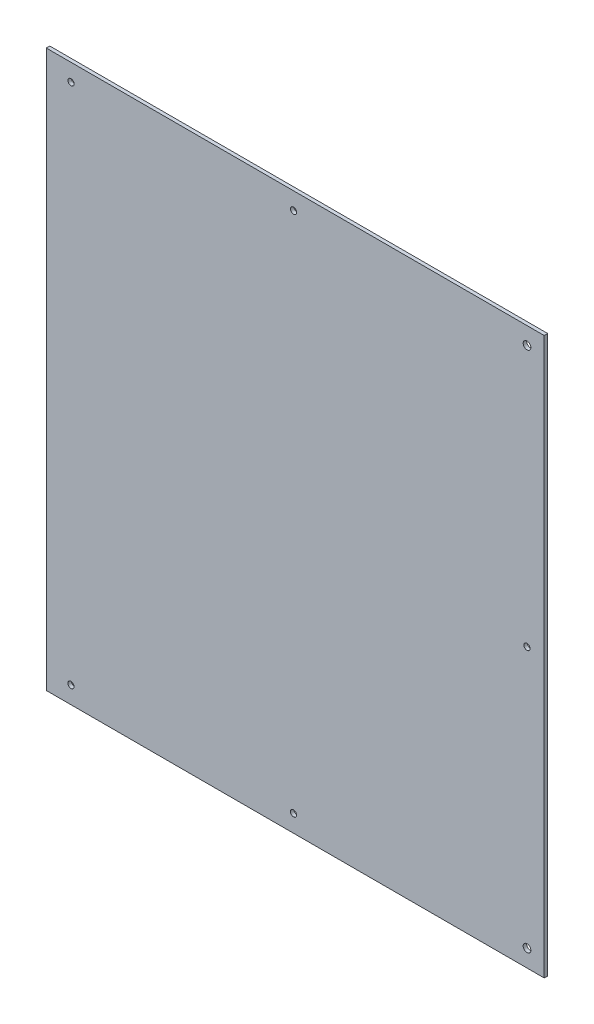
ISO-10303-21;
HEADER;
FILE_DESCRIPTION(('STEP AP214'),'2;1');
FILE_NAME('part.step','',(''),(''),'','','');
FILE_SCHEMA(('AUTOMOTIVE_DESIGN { 1 0 10303 214 1 1 1 1 }'));
ENDSEC;
DATA;
#1=APPLICATION_CONTEXT('core data for automotive mechanical design processes');
#2=APPLICATION_PROTOCOL_DEFINITION('international standard','automotive_design',2000,#1);
#3=PRODUCT_CONTEXT('',#1,'mechanical');
#4=PRODUCT('Part','Part','',(#3));
#5=PRODUCT_RELATED_PRODUCT_CATEGORY('part','',(#4));
#6=PRODUCT_DEFINITION_FORMATION('','',#4);
#7=PRODUCT_DEFINITION_CONTEXT('part definition',#1,'design');
#8=PRODUCT_DEFINITION('design','',#6,#7);
#9=PRODUCT_DEFINITION_SHAPE('','',#8);
#10=(LENGTH_UNIT() NAMED_UNIT(*) SI_UNIT(.MILLI.,.METRE.));
#11=(NAMED_UNIT(*) PLANE_ANGLE_UNIT() SI_UNIT($,.RADIAN.));
#12=(NAMED_UNIT(*) SI_UNIT($,.STERADIAN.) SOLID_ANGLE_UNIT());
#13=UNCERTAINTY_MEASURE_WITH_UNIT(LENGTH_MEASURE(1.E-05),#10,'distance_accuracy_value','');
#14=(GEOMETRIC_REPRESENTATION_CONTEXT(3) GLOBAL_UNCERTAINTY_ASSIGNED_CONTEXT((#13)) GLOBAL_UNIT_ASSIGNED_CONTEXT((#10,
#11,#12)) REPRESENTATION_CONTEXT('',''));
#15=CARTESIAN_POINT('',(0.,0.,0.));
#16=DIRECTION('',(0.,0.,1.));
#17=DIRECTION('',(1.,0.,0.));
#18=AXIS2_PLACEMENT_3D('',#15,#16,#17);
#19=CARTESIAN_POINT('',(0.,0.,3.175));
#20=DIRECTION('',(0.,0.,-1.));
#21=DIRECTION('',(-1.,0.,0.));
#22=AXIS2_PLACEMENT_3D('',#19,#20,#21);
#23=PLANE('',#22);
#24=DIRECTION('',(1.,0.,0.));
#25=VECTOR('',#24,1.);
#26=CARTESIAN_POINT('',(0.,253.175,3.175));
#27=LINE('',#26,#25);
#28=CARTESIAN_POINT('',(-225.,253.175,3.175));
#29=VERTEX_POINT('',#28);
#30=CARTESIAN_POINT('',(228.175,253.175,3.175));
#31=VERTEX_POINT('',#30);
#32=EDGE_CURVE('E112',#29,#31,#27,.T.);
#33=ORIENTED_EDGE('',*,*,#32,.F.);
#34=DIRECTION('',(0.,-1.,0.));
#35=VECTOR('',#34,1.);
#36=CARTESIAN_POINT('',(-225.,-250.,3.175));
#37=LINE('',#36,#35);
#38=CARTESIAN_POINT('',(-225.,-253.175,3.175));
#39=VERTEX_POINT('',#38);
#40=EDGE_CURVE('E11',#29,#39,#37,.T.);
#41=ORIENTED_EDGE('',*,*,#40,.T.);
#42=DIRECTION('',(1.,0.,0.));
#43=VECTOR('',#42,1.);
#44=CARTESIAN_POINT('',(0.,-253.175,3.175));
#45=LINE('',#44,#43);
#46=CARTESIAN_POINT('',(228.175,-253.175,3.175));
#47=VERTEX_POINT('',#46);
#48=EDGE_CURVE('E107',#39,#47,#45,.T.);
#49=ORIENTED_EDGE('',*,*,#48,.T.);
#50=DIRECTION('',(0.,-1.,0.));
#51=VECTOR('',#50,1.);
#52=CARTESIAN_POINT('',(228.175000000002,-1.99468613105393E-12,3.175));
#53=LINE('',#52,#51);
#54=EDGE_CURVE('E110',#31,#47,#53,.T.);
#55=ORIENTED_EDGE('',*,*,#54,.F.);
#56=EDGE_LOOP('',(#33,#41,#49,#55));
#57=FACE_BOUND('',#56,.T.);
#58=CARTESIAN_POINT('',(212.5,237.5,3.175));
#59=DIRECTION('',(0.,0.,1.));
#60=DIRECTION('',(1.,0.,0.));
#61=AXIS2_PLACEMENT_3D('',#58,#59,#60);
#62=CIRCLE('',#61,3.49999999999999);
#63=CARTESIAN_POINT('',(216.,237.5,3.175));
#64=VERTEX_POINT('',#63);
#65=EDGE_CURVE('E96',#64,#64,#62,.T.);
#66=ORIENTED_EDGE('',*,*,#65,.F.);
#67=EDGE_LOOP('',(#66));
#68=FACE_BOUND('',#67,.T.);
#69=CARTESIAN_POINT('',(212.5,-237.5,3.175));
#70=DIRECTION('',(0.,0.,1.));
#71=DIRECTION('',(1.,0.,0.));
#72=AXIS2_PLACEMENT_3D('',#69,#70,#71);
#73=CIRCLE('',#72,3.49999999999999);
#74=CARTESIAN_POINT('',(216.,-237.5,3.175));
#75=VERTEX_POINT('',#74);
#76=EDGE_CURVE('E149',#75,#75,#73,.T.);
#77=ORIENTED_EDGE('',*,*,#76,.F.);
#78=EDGE_LOOP('',(#77));
#79=FACE_BOUND('',#78,.T.);
#80=CARTESIAN_POINT('',(-202.5,-237.5,3.175));
#81=DIRECTION('',(0.,0.,1.));
#82=DIRECTION('',(1.,0.,0.));
#83=AXIS2_PLACEMENT_3D('',#80,#81,#82);
#84=CIRCLE('',#83,2.8);
#85=CARTESIAN_POINT('',(-199.7,-237.5,3.175));
#86=VERTEX_POINT('',#85);
#87=EDGE_CURVE('E143',#86,#86,#84,.T.);
#88=ORIENTED_EDGE('',*,*,#87,.F.);
#89=EDGE_LOOP('',(#88));
#90=FACE_BOUND('',#89,.T.);
#91=CARTESIAN_POINT('',(-202.5,237.5,3.175));
#92=DIRECTION('',(0.,0.,1.));
#93=DIRECTION('',(1.,0.,0.));
#94=AXIS2_PLACEMENT_3D('',#91,#92,#93);
#95=CIRCLE('',#94,2.8);
#96=CARTESIAN_POINT('',(-199.7,237.5,3.175));
#97=VERTEX_POINT('',#96);
#98=EDGE_CURVE('E137',#97,#97,#95,.T.);
#99=ORIENTED_EDGE('',*,*,#98,.F.);
#100=EDGE_LOOP('',(#99));
#101=FACE_BOUND('',#100,.T.);
#102=CARTESIAN_POINT('',(0.,-237.5,3.175));
#103=DIRECTION('',(0.,0.,1.));
#104=DIRECTION('',(1.,0.,0.));
#105=AXIS2_PLACEMENT_3D('',#102,#103,#104);
#106=CIRCLE('',#105,2.80000000000001);
#107=CARTESIAN_POINT('',(2.80000000000003,-237.5,3.175));
#108=VERTEX_POINT('',#107);
#109=EDGE_CURVE('E131',#108,#108,#106,.T.);
#110=ORIENTED_EDGE('',*,*,#109,.F.);
#111=EDGE_LOOP('',(#110));
#112=FACE_BOUND('',#111,.T.);
#113=CARTESIAN_POINT('',(0.,237.5,3.175));
#114=DIRECTION('',(0.,0.,1.));
#115=DIRECTION('',(1.,0.,0.));
#116=AXIS2_PLACEMENT_3D('',#113,#114,#115);
#117=CIRCLE('',#116,2.80000000000001);
#118=CARTESIAN_POINT('',(2.80000000000003,237.5,3.175));
#119=VERTEX_POINT('',#118);
#120=EDGE_CURVE('E125',#119,#119,#117,.T.);
#121=ORIENTED_EDGE('',*,*,#120,.F.);
#122=EDGE_LOOP('',(#121));
#123=FACE_BOUND('',#122,.T.);
#124=CARTESIAN_POINT('',(212.5,0.,3.175));
#125=DIRECTION('',(0.,0.,1.));
#126=DIRECTION('',(1.,0.,0.));
#127=AXIS2_PLACEMENT_3D('',#124,#125,#126);
#128=CIRCLE('',#127,2.8);
#129=CARTESIAN_POINT('',(215.3,0.,3.175));
#130=VERTEX_POINT('',#129);
#131=EDGE_CURVE('E119',#130,#130,#128,.T.);
#132=ORIENTED_EDGE('',*,*,#131,.F.);
#133=EDGE_LOOP('',(#132));
#134=FACE_BOUND('',#133,.T.);
#135=ADVANCED_FACE('F44',(#57,#68,#79,#90,#101,#112,#123,#134),#23,.F.);
#136=CARTESIAN_POINT('',(0.,0.,0.));
#137=DIRECTION('',(0.,0.,-1.));
#138=DIRECTION('',(-1.,0.,0.));
#139=AXIS2_PLACEMENT_3D('',#136,#137,#138);
#140=PLANE('',#139);
#141=DIRECTION('',(0.,-1.,0.));
#142=VECTOR('',#141,1.);
#143=CARTESIAN_POINT('',(-225.,-250.,0.));
#144=LINE('',#143,#142);
#145=CARTESIAN_POINT('',(-225.,253.175,0.));
#146=VERTEX_POINT('',#145);
#147=CARTESIAN_POINT('',(-225.,-253.175,0.));
#148=VERTEX_POINT('',#147);
#149=EDGE_CURVE('E48',#146,#148,#144,.T.);
#150=ORIENTED_EDGE('',*,*,#149,.F.);
#151=DIRECTION('',(1.,0.,0.));
#152=VECTOR('',#151,1.);
#153=CARTESIAN_POINT('',(0.,253.175,0.));
#154=LINE('',#153,#152);
#155=CARTESIAN_POINT('',(228.175,253.175,0.));
#156=VERTEX_POINT('',#155);
#157=EDGE_CURVE('E88',#146,#156,#154,.T.);
#158=ORIENTED_EDGE('',*,*,#157,.T.);
#159=DIRECTION('',(0.,-1.,0.));
#160=VECTOR('',#159,1.);
#161=CARTESIAN_POINT('',(228.175000000002,-1.99468613105393E-12,0.));
#162=LINE('',#161,#160);
#163=CARTESIAN_POINT('',(228.175,-253.175,0.));
#164=VERTEX_POINT('',#163);
#165=EDGE_CURVE('E61',#156,#164,#162,.T.);
#166=ORIENTED_EDGE('',*,*,#165,.T.);
#167=DIRECTION('',(1.,0.,0.));
#168=VECTOR('',#167,1.);
#169=CARTESIAN_POINT('',(0.,-253.175,0.));
#170=LINE('',#169,#168);
#171=EDGE_CURVE('E93',#148,#164,#170,.T.);
#172=ORIENTED_EDGE('',*,*,#171,.F.);
#173=EDGE_LOOP('',(#150,#158,#166,#172));
#174=FACE_BOUND('',#173,.T.);
#175=CARTESIAN_POINT('',(0.,237.5,0.));
#176=DIRECTION('',(0.,0.,1.));
#177=DIRECTION('',(1.,0.,0.));
#178=AXIS2_PLACEMENT_3D('',#175,#176,#177);
#179=CIRCLE('',#178,2.80000000000001);
#180=CARTESIAN_POINT('',(2.80000000000003,237.5,0.));
#181=VERTEX_POINT('',#180);
#182=EDGE_CURVE('E122',#181,#181,#179,.T.);
#183=ORIENTED_EDGE('',*,*,#182,.T.);
#184=EDGE_LOOP('',(#183));
#185=FACE_BOUND('',#184,.T.);
#186=CARTESIAN_POINT('',(-202.5,237.5,0.));
#187=DIRECTION('',(0.,0.,1.));
#188=DIRECTION('',(1.,0.,0.));
#189=AXIS2_PLACEMENT_3D('',#186,#187,#188);
#190=CIRCLE('',#189,2.8);
#191=CARTESIAN_POINT('',(-199.7,237.5,0.));
#192=VERTEX_POINT('',#191);
#193=EDGE_CURVE('E134',#192,#192,#190,.T.);
#194=ORIENTED_EDGE('',*,*,#193,.T.);
#195=EDGE_LOOP('',(#194));
#196=FACE_BOUND('',#195,.T.);
#197=CARTESIAN_POINT('',(212.5,-237.5,0.));
#198=DIRECTION('',(0.,0.,1.));
#199=DIRECTION('',(1.,0.,0.));
#200=AXIS2_PLACEMENT_3D('',#197,#198,#199);
#201=CIRCLE('',#200,3.49999999999999);
#202=CARTESIAN_POINT('',(216.,-237.5,0.));
#203=VERTEX_POINT('',#202);
#204=EDGE_CURVE('E146',#203,#203,#201,.T.);
#205=ORIENTED_EDGE('',*,*,#204,.T.);
#206=EDGE_LOOP('',(#205));
#207=FACE_BOUND('',#206,.T.);
#208=CARTESIAN_POINT('',(212.5,237.5,0.));
#209=DIRECTION('',(0.,0.,1.));
#210=DIRECTION('',(1.,0.,0.));
#211=AXIS2_PLACEMENT_3D('',#208,#209,#210);
#212=CIRCLE('',#211,3.49999999999999);
#213=CARTESIAN_POINT('',(216.,237.5,0.));
#214=VERTEX_POINT('',#213);
#215=EDGE_CURVE('E152',#214,#214,#212,.T.);
#216=ORIENTED_EDGE('',*,*,#215,.T.);
#217=EDGE_LOOP('',(#216));
#218=FACE_BOUND('',#217,.T.);
#219=CARTESIAN_POINT('',(-202.5,-237.5,0.));
#220=DIRECTION('',(0.,0.,1.));
#221=DIRECTION('',(1.,0.,0.));
#222=AXIS2_PLACEMENT_3D('',#219,#220,#221);
#223=CIRCLE('',#222,2.8);
#224=CARTESIAN_POINT('',(-199.7,-237.5,0.));
#225=VERTEX_POINT('',#224);
#226=EDGE_CURVE('E140',#225,#225,#223,.T.);
#227=ORIENTED_EDGE('',*,*,#226,.T.);
#228=EDGE_LOOP('',(#227));
#229=FACE_BOUND('',#228,.T.);
#230=CARTESIAN_POINT('',(0.,-237.5,0.));
#231=DIRECTION('',(0.,0.,1.));
#232=DIRECTION('',(1.,0.,0.));
#233=AXIS2_PLACEMENT_3D('',#230,#231,#232);
#234=CIRCLE('',#233,2.80000000000001);
#235=CARTESIAN_POINT('',(2.80000000000003,-237.5,0.));
#236=VERTEX_POINT('',#235);
#237=EDGE_CURVE('E128',#236,#236,#234,.T.);
#238=ORIENTED_EDGE('',*,*,#237,.T.);
#239=EDGE_LOOP('',(#238));
#240=FACE_BOUND('',#239,.T.);
#241=CARTESIAN_POINT('',(212.5,0.,0.));
#242=DIRECTION('',(0.,0.,1.));
#243=DIRECTION('',(1.,0.,0.));
#244=AXIS2_PLACEMENT_3D('',#241,#242,#243);
#245=CIRCLE('',#244,2.8);
#246=CARTESIAN_POINT('',(215.3,0.,0.));
#247=VERTEX_POINT('',#246);
#248=EDGE_CURVE('E116',#247,#247,#245,.T.);
#249=ORIENTED_EDGE('',*,*,#248,.T.);
#250=EDGE_LOOP('',(#249));
#251=FACE_BOUND('',#250,.T.);
#252=ADVANCED_FACE('F91',(#174,#185,#196,#207,#218,#229,#240,#251),#140,.T.);
#253=CARTESIAN_POINT('',(-225.,-250.,3.175));
#254=DIRECTION('',(1.,0.,0.));
#255=DIRECTION('',(0.,0.,-1.));
#256=AXIS2_PLACEMENT_3D('',#253,#254,#255);
#257=PLANE('',#256);
#258=ORIENTED_EDGE('',*,*,#149,.T.);
#259=DIRECTION('',(0.,0.,1.));
#260=VECTOR('',#259,1.);
#261=CARTESIAN_POINT('',(-225.,-253.175,0.));
#262=LINE('',#261,#260);
#263=EDGE_CURVE('E100',#148,#39,#262,.T.);
#264=ORIENTED_EDGE('',*,*,#263,.T.);
#265=ORIENTED_EDGE('',*,*,#40,.F.);
#266=DIRECTION('',(0.,0.,1.));
#267=VECTOR('',#266,1.);
#268=CARTESIAN_POINT('',(-225.,253.175,0.));
#269=LINE('',#268,#267);
#270=EDGE_CURVE('E98',#146,#29,#269,.T.);
#271=ORIENTED_EDGE('',*,*,#270,.F.);
#272=EDGE_LOOP('',(#258,#264,#265,#271));
#273=FACE_BOUND('',#272,.T.);
#274=ADVANCED_FACE('F46',(#273),#257,.F.);
#275=CARTESIAN_POINT('',(212.5,237.5,3.175));
#276=DIRECTION('',(0.,0.,-1.));
#277=DIRECTION('',(-1.,0.,0.));
#278=AXIS2_PLACEMENT_3D('',#275,#276,#277);
#279=CYLINDRICAL_SURFACE('',#278,3.49999999999999);
#280=ORIENTED_EDGE('',*,*,#65,.T.);
#281=EDGE_LOOP('',(#280));
#282=FACE_BOUND('',#281,.T.);
#283=ORIENTED_EDGE('',*,*,#215,.F.);
#284=EDGE_LOOP('',(#283));
#285=FACE_BOUND('',#284,.T.);
#286=ADVANCED_FACE('F162',(#282,#285),#279,.F.);
#287=CARTESIAN_POINT('',(212.5,-237.5,3.175));
#288=DIRECTION('',(0.,0.,-1.));
#289=DIRECTION('',(-1.,0.,0.));
#290=AXIS2_PLACEMENT_3D('',#287,#288,#289);
#291=CYLINDRICAL_SURFACE('',#290,3.49999999999999);
#292=ORIENTED_EDGE('',*,*,#76,.T.);
#293=EDGE_LOOP('',(#292));
#294=FACE_BOUND('',#293,.T.);
#295=ORIENTED_EDGE('',*,*,#204,.F.);
#296=EDGE_LOOP('',(#295));
#297=FACE_BOUND('',#296,.T.);
#298=ADVANCED_FACE('F164',(#294,#297),#291,.F.);
#299=CARTESIAN_POINT('',(-202.5,-237.5,3.175));
#300=DIRECTION('',(0.,0.,-1.));
#301=DIRECTION('',(-1.,0.,0.));
#302=AXIS2_PLACEMENT_3D('',#299,#300,#301);
#303=CYLINDRICAL_SURFACE('',#302,2.8);
#304=ORIENTED_EDGE('',*,*,#87,.T.);
#305=EDGE_LOOP('',(#304));
#306=FACE_BOUND('',#305,.T.);
#307=ORIENTED_EDGE('',*,*,#226,.F.);
#308=EDGE_LOOP('',(#307));
#309=FACE_BOUND('',#308,.T.);
#310=ADVANCED_FACE('F170',(#306,#309),#303,.F.);
#311=CARTESIAN_POINT('',(-202.5,237.5,3.175));
#312=DIRECTION('',(0.,0.,-1.));
#313=DIRECTION('',(-1.,0.,0.));
#314=AXIS2_PLACEMENT_3D('',#311,#312,#313);
#315=CYLINDRICAL_SURFACE('',#314,2.8);
#316=ORIENTED_EDGE('',*,*,#98,.T.);
#317=EDGE_LOOP('',(#316));
#318=FACE_BOUND('',#317,.T.);
#319=ORIENTED_EDGE('',*,*,#193,.F.);
#320=EDGE_LOOP('',(#319));
#321=FACE_BOUND('',#320,.T.);
#322=ADVANCED_FACE('F217',(#318,#321),#315,.F.);
#323=CARTESIAN_POINT('',(0.,-237.5,3.175));
#324=DIRECTION('',(0.,0.,-1.));
#325=DIRECTION('',(-1.,0.,0.));
#326=AXIS2_PLACEMENT_3D('',#323,#324,#325);
#327=CYLINDRICAL_SURFACE('',#326,2.80000000000001);
#328=ORIENTED_EDGE('',*,*,#109,.T.);
#329=EDGE_LOOP('',(#328));
#330=FACE_BOUND('',#329,.T.);
#331=ORIENTED_EDGE('',*,*,#237,.F.);
#332=EDGE_LOOP('',(#331));
#333=FACE_BOUND('',#332,.T.);
#334=ADVANCED_FACE('F210',(#330,#333),#327,.F.);
#335=CARTESIAN_POINT('',(0.,237.5,3.175));
#336=DIRECTION('',(0.,0.,-1.));
#337=DIRECTION('',(-1.,0.,0.));
#338=AXIS2_PLACEMENT_3D('',#335,#336,#337);
#339=CYLINDRICAL_SURFACE('',#338,2.80000000000001);
#340=ORIENTED_EDGE('',*,*,#120,.T.);
#341=EDGE_LOOP('',(#340));
#342=FACE_BOUND('',#341,.T.);
#343=ORIENTED_EDGE('',*,*,#182,.F.);
#344=EDGE_LOOP('',(#343));
#345=FACE_BOUND('',#344,.T.);
#346=ADVANCED_FACE('F199',(#342,#345),#339,.F.);
#347=CARTESIAN_POINT('',(212.5,0.,3.175));
#348=DIRECTION('',(0.,0.,-1.));
#349=DIRECTION('',(-1.,0.,0.));
#350=AXIS2_PLACEMENT_3D('',#347,#348,#349);
#351=CYLINDRICAL_SURFACE('',#350,2.8);
#352=ORIENTED_EDGE('',*,*,#131,.T.);
#353=EDGE_LOOP('',(#352));
#354=FACE_BOUND('',#353,.T.);
#355=ORIENTED_EDGE('',*,*,#248,.F.);
#356=EDGE_LOOP('',(#355));
#357=FACE_BOUND('',#356,.T.);
#358=ADVANCED_FACE('F196',(#354,#357),#351,.F.);
#359=CARTESIAN_POINT('',(228.175000000002,-1.99468613105393E-12,0.));
#360=DIRECTION('',(-1.,0.,0.));
#361=DIRECTION('',(0.,-1.,0.));
#362=AXIS2_PLACEMENT_3D('',#359,#360,#361);
#363=PLANE('',#362);
#364=ORIENTED_EDGE('',*,*,#54,.T.);
#365=DIRECTION('',(0.,0.,1.));
#366=VECTOR('',#365,1.);
#367=CARTESIAN_POINT('',(228.175,-253.175,0.));
#368=LINE('',#367,#366);
#369=EDGE_CURVE('E83',#164,#47,#368,.T.);
#370=ORIENTED_EDGE('',*,*,#369,.F.);
#371=ORIENTED_EDGE('',*,*,#165,.F.);
#372=DIRECTION('',(0.,0.,1.));
#373=VECTOR('',#372,1.);
#374=CARTESIAN_POINT('',(228.175,253.175,0.));
#375=LINE('',#374,#373);
#376=EDGE_CURVE('E101',#156,#31,#375,.T.);
#377=ORIENTED_EDGE('',*,*,#376,.T.);
#378=EDGE_LOOP('',(#364,#370,#371,#377));
#379=FACE_BOUND('',#378,.T.);
#380=ADVANCED_FACE('F198',(#379),#363,.F.);
#381=CARTESIAN_POINT('',(0.,-253.175,0.));
#382=DIRECTION('',(0.,-1.,0.));
#383=DIRECTION('',(0.,0.,-1.));
#384=AXIS2_PLACEMENT_3D('',#381,#382,#383);
#385=PLANE('',#384);
#386=ORIENTED_EDGE('',*,*,#48,.F.);
#387=ORIENTED_EDGE('',*,*,#263,.F.);
#388=ORIENTED_EDGE('',*,*,#171,.T.);
#389=ORIENTED_EDGE('',*,*,#369,.T.);
#390=EDGE_LOOP('',(#386,#387,#388,#389));
#391=FACE_BOUND('',#390,.T.);
#392=ADVANCED_FACE('F207',(#391),#385,.T.);
#393=CARTESIAN_POINT('',(0.,253.175,0.));
#394=DIRECTION('',(0.,-1.,0.));
#395=DIRECTION('',(0.,0.,-1.));
#396=AXIS2_PLACEMENT_3D('',#393,#394,#395);
#397=PLANE('',#396);
#398=ORIENTED_EDGE('',*,*,#32,.T.);
#399=ORIENTED_EDGE('',*,*,#376,.F.);
#400=ORIENTED_EDGE('',*,*,#157,.F.);
#401=ORIENTED_EDGE('',*,*,#270,.T.);
#402=EDGE_LOOP('',(#398,#399,#400,#401));
#403=FACE_BOUND('',#402,.T.);
#404=ADVANCED_FACE('F103',(#403),#397,.F.);
#405=CLOSED_SHELL('',(#135,#252,#274,#286,#298,#310,#322,#334,#346,#358,#380,#392,#404));
#406=MANIFOLD_SOLID_BREP('B2',#405);
#407=ADVANCED_BREP_SHAPE_REPRESENTATION('',(#18,#406),#14);
#408=SHAPE_DEFINITION_REPRESENTATION(#9,#407);
ENDSEC;
END-ISO-10303-21;
